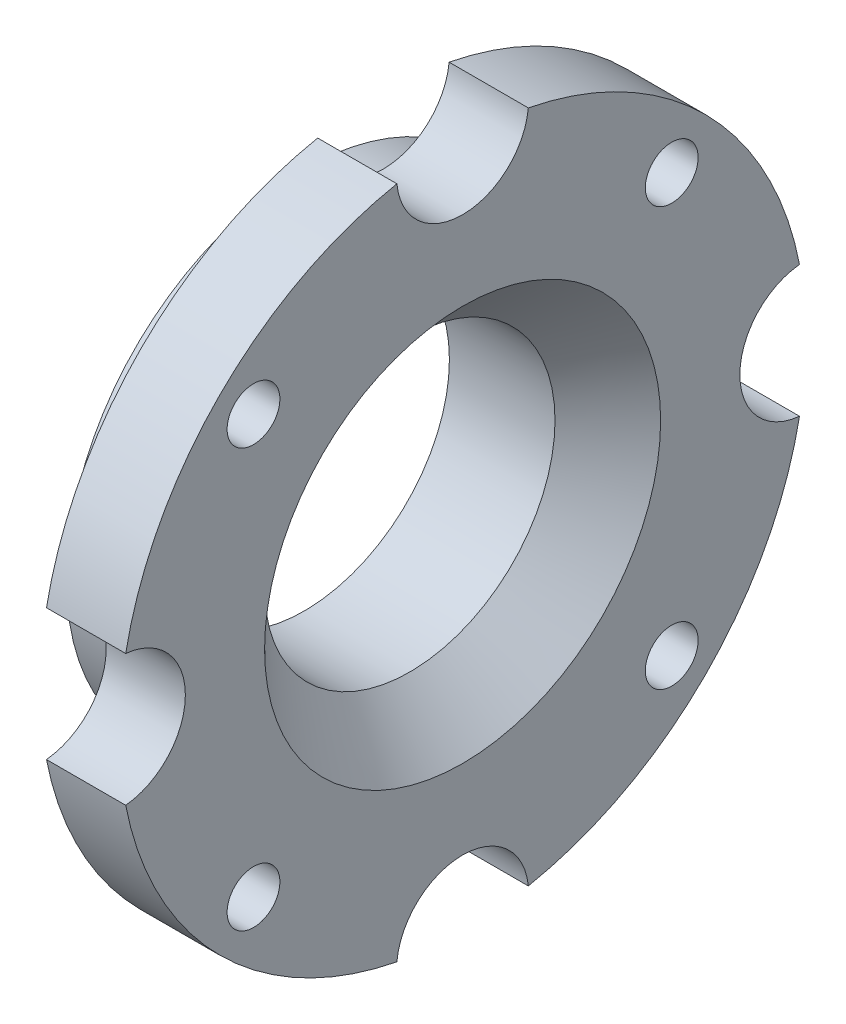
ISO-10303-21;
HEADER;
FILE_DESCRIPTION(('STEP AP214'),'2;1');
FILE_NAME('part.step','',(''),(''),'','','');
FILE_SCHEMA(('AUTOMOTIVE_DESIGN { 1 0 10303 214 1 1 1 1 }'));
ENDSEC;
DATA;
#1=APPLICATION_CONTEXT('core data for automotive mechanical design processes');
#2=APPLICATION_PROTOCOL_DEFINITION('international standard','automotive_design',2000,#1);
#3=PRODUCT_CONTEXT('',#1,'mechanical');
#4=PRODUCT('Part','Part','',(#3));
#5=PRODUCT_RELATED_PRODUCT_CATEGORY('part','',(#4));
#6=PRODUCT_DEFINITION_FORMATION('','',#4);
#7=PRODUCT_DEFINITION_CONTEXT('part definition',#1,'design');
#8=PRODUCT_DEFINITION('design','',#6,#7);
#9=PRODUCT_DEFINITION_SHAPE('','',#8);
#10=(LENGTH_UNIT() NAMED_UNIT(*) SI_UNIT(.MILLI.,.METRE.));
#11=(NAMED_UNIT(*) PLANE_ANGLE_UNIT() SI_UNIT($,.RADIAN.));
#12=(NAMED_UNIT(*) SI_UNIT($,.STERADIAN.) SOLID_ANGLE_UNIT());
#13=UNCERTAINTY_MEASURE_WITH_UNIT(LENGTH_MEASURE(1.E-05),#10,'distance_accuracy_value','');
#14=(GEOMETRIC_REPRESENTATION_CONTEXT(3) GLOBAL_UNCERTAINTY_ASSIGNED_CONTEXT((#13)) GLOBAL_UNIT_ASSIGNED_CONTEXT((#10,
#11,#12)) REPRESENTATION_CONTEXT('',''));
#15=CARTESIAN_POINT('',(0.,0.,0.));
#16=DIRECTION('',(0.,0.,1.));
#17=DIRECTION('',(1.,0.,0.));
#18=AXIS2_PLACEMENT_3D('',#15,#16,#17);
#19=CARTESIAN_POINT('',(6.,0.,0.));
#20=DIRECTION('',(-1.,0.,0.));
#21=DIRECTION('',(0.,0.,1.));
#22=AXIS2_PLACEMENT_3D('',#19,#20,#21);
#23=CYLINDRICAL_SURFACE('',#22,13.);
#24=CARTESIAN_POINT('',(3.,0.,0.));
#25=DIRECTION('',(1.,0.,0.));
#26=DIRECTION('',(0.,0.,-1.));
#27=AXIS2_PLACEMENT_3D('',#24,#25,#26);
#28=CIRCLE('',#27,13.);
#29=CARTESIAN_POINT('',(3.,2.48841621050146,-12.7596153846154));
#30=VERTEX_POINT('',#29);
#31=CARTESIAN_POINT('',(3.,12.7596153846154,-2.48841621050145));
#32=VERTEX_POINT('',#31);
#33=EDGE_CURVE('E139',#30,#32,#28,.T.);
#34=ORIENTED_EDGE('',*,*,#33,.T.);
#35=DIRECTION('',(1.,0.,0.));
#36=VECTOR('',#35,1.);
#37=CARTESIAN_POINT('',(3.,12.7596153846154,-2.48841621050145));
#38=LINE('',#37,#36);
#39=CARTESIAN_POINT('',(6.,12.7596153846154,-2.48841621050145));
#40=VERTEX_POINT('',#39);
#41=EDGE_CURVE('E164',#32,#40,#38,.T.);
#42=ORIENTED_EDGE('',*,*,#41,.T.);
#43=CARTESIAN_POINT('',(6.,0.,0.));
#44=DIRECTION('',(1.,0.,0.));
#45=DIRECTION('',(0.,0.,-1.));
#46=AXIS2_PLACEMENT_3D('',#43,#44,#45);
#47=CIRCLE('',#46,13.);
#48=CARTESIAN_POINT('',(6.,2.48841621050146,-12.7596153846154));
#49=VERTEX_POINT('',#48);
#50=EDGE_CURVE('E130',#49,#40,#47,.T.);
#51=ORIENTED_EDGE('',*,*,#50,.F.);
#52=DIRECTION('',(1.,0.,0.));
#53=VECTOR('',#52,1.);
#54=CARTESIAN_POINT('',(3.,2.48841621050146,-12.7596153846154));
#55=LINE('',#54,#53);
#56=EDGE_CURVE('E156',#49,#30,#55,.F.);
#57=ORIENTED_EDGE('',*,*,#56,.T.);
#58=EDGE_LOOP('',(#34,#42,#51,#57));
#59=FACE_BOUND('',#58,.T.);
#60=ADVANCED_FACE('F40',(#59),#23,.T.);
#61=CARTESIAN_POINT('',(3.,-12.7596153846154,-2.48841621050146));
#62=VERTEX_POINT('',#61);
#63=CARTESIAN_POINT('',(3.,-2.48841621050144,-12.7596153846154));
#64=VERTEX_POINT('',#63);
#65=EDGE_CURVE('E142',#62,#64,#28,.T.);
#66=ORIENTED_EDGE('',*,*,#65,.T.);
#67=DIRECTION('',(1.,0.,0.));
#68=VECTOR('',#67,1.);
#69=CARTESIAN_POINT('',(3.,-2.48841621050144,-12.7596153846154));
#70=LINE('',#69,#68);
#71=CARTESIAN_POINT('',(6.,-2.48841621050144,-12.7596153846154));
#72=VERTEX_POINT('',#71);
#73=EDGE_CURVE('E159',#64,#72,#70,.T.);
#74=ORIENTED_EDGE('',*,*,#73,.T.);
#75=CARTESIAN_POINT('',(6.,-12.7596153846154,-2.48841621050145));
#76=VERTEX_POINT('',#75);
#77=EDGE_CURVE('E134',#76,#72,#47,.T.);
#78=ORIENTED_EDGE('',*,*,#77,.F.);
#79=DIRECTION('',(1.,0.,0.));
#80=VECTOR('',#79,1.);
#81=CARTESIAN_POINT('',(3.,-12.7596153846154,-2.48841621050145));
#82=LINE('',#81,#80);
#83=EDGE_CURVE('E123',#76,#62,#82,.F.);
#84=ORIENTED_EDGE('',*,*,#83,.T.);
#85=EDGE_LOOP('',(#66,#74,#78,#84));
#86=FACE_BOUND('',#85,.T.);
#87=ADVANCED_FACE('F196',(#86),#23,.T.);
#88=CARTESIAN_POINT('',(3.,-2.48841621050146,12.7596153846154));
#89=VERTEX_POINT('',#88);
#90=CARTESIAN_POINT('',(3.,-12.7596153846154,2.48841621050145));
#91=VERTEX_POINT('',#90);
#92=EDGE_CURVE('E227',#89,#91,#28,.T.);
#93=ORIENTED_EDGE('',*,*,#92,.T.);
#94=DIRECTION('',(1.,0.,0.));
#95=VECTOR('',#94,1.);
#96=CARTESIAN_POINT('',(3.,-12.7596153846154,2.48841621050145));
#97=LINE('',#96,#95);
#98=CARTESIAN_POINT('',(6.,-12.7596153846154,2.48841621050145));
#99=VERTEX_POINT('',#98);
#100=EDGE_CURVE('E153',#91,#99,#97,.T.);
#101=ORIENTED_EDGE('',*,*,#100,.T.);
#102=CARTESIAN_POINT('',(6.,-2.48841621050146,12.7596153846154));
#103=VERTEX_POINT('',#102);
#104=EDGE_CURVE('E131',#103,#99,#47,.T.);
#105=ORIENTED_EDGE('',*,*,#104,.F.);
#106=DIRECTION('',(1.,0.,0.));
#107=VECTOR('',#106,1.);
#108=CARTESIAN_POINT('',(3.,-2.48841621050146,12.7596153846154));
#109=LINE('',#108,#107);
#110=EDGE_CURVE('E108',#103,#89,#109,.F.);
#111=ORIENTED_EDGE('',*,*,#110,.T.);
#112=EDGE_LOOP('',(#93,#101,#105,#111));
#113=FACE_BOUND('',#112,.T.);
#114=ADVANCED_FACE('F203',(#113),#23,.T.);
#115=CARTESIAN_POINT('',(0.,0.,0.));
#116=DIRECTION('',(1.,0.,0.));
#117=DIRECTION('',(0.,0.,-1.));
#118=AXIS2_PLACEMENT_3D('',#115,#116,#117);
#119=PLANE('',#118);
#120=CARTESIAN_POINT('',(0.,0.,0.));
#121=DIRECTION('',(1.,0.,0.));
#122=DIRECTION('',(0.,0.,-1.));
#123=AXIS2_PLACEMENT_3D('',#120,#121,#122);
#124=CIRCLE('',#123,9.);
#125=CARTESIAN_POINT('',(0.,0.,-9.));
#126=VERTEX_POINT('',#125);
#127=EDGE_CURVE('E145',#126,#126,#124,.T.);
#128=ORIENTED_EDGE('',*,*,#127,.F.);
#129=EDGE_LOOP('',(#128));
#130=FACE_BOUND('',#129,.T.);
#131=CARTESIAN_POINT('',(0.,0.,0.));
#132=DIRECTION('',(1.,0.,0.));
#133=DIRECTION('',(0.,0.,-1.));
#134=AXIS2_PLACEMENT_3D('',#131,#132,#133);
#135=CIRCLE('',#134,5.5);
#136=CARTESIAN_POINT('',(0.,0.,-5.5));
#137=VERTEX_POINT('',#136);
#138=EDGE_CURVE('E133',#137,#137,#135,.T.);
#139=ORIENTED_EDGE('',*,*,#138,.T.);
#140=EDGE_LOOP('',(#139));
#141=FACE_BOUND('',#140,.T.);
#142=ADVANCED_FACE('F217',(#130,#141),#119,.F.);
#143=CARTESIAN_POINT('',(3.,0.,0.));
#144=DIRECTION('',(-1.,0.,0.));
#145=DIRECTION('',(0.,0.,1.));
#146=AXIS2_PLACEMENT_3D('',#143,#144,#145);
#147=CYLINDRICAL_SURFACE('',#146,9.);
#148=CARTESIAN_POINT('',(3.,0.,0.));
#149=DIRECTION('',(1.,0.,0.));
#150=DIRECTION('',(0.,0.,-1.));
#151=AXIS2_PLACEMENT_3D('',#148,#149,#150);
#152=CIRCLE('',#151,9.);
#153=CARTESIAN_POINT('',(3.,0.,-9.));
#154=VERTEX_POINT('',#153);
#155=EDGE_CURVE('E146',#154,#154,#152,.T.);
#156=ORIENTED_EDGE('',*,*,#155,.F.);
#157=EDGE_LOOP('',(#156));
#158=FACE_BOUND('',#157,.T.);
#159=ORIENTED_EDGE('',*,*,#127,.T.);
#160=EDGE_LOOP('',(#159));
#161=FACE_BOUND('',#160,.T.);
#162=ADVANCED_FACE('F222',(#158,#161),#147,.T.);
#163=CARTESIAN_POINT('',(3.,0.,0.));
#164=DIRECTION('',(-1.,0.,0.));
#165=DIRECTION('',(0.,0.,1.));
#166=AXIS2_PLACEMENT_3D('',#163,#164,#165);
#167=CYLINDRICAL_SURFACE('',#166,5.5);
#168=CARTESIAN_POINT('',(3.99999999999998,0.,0.));
#169=DIRECTION('',(1.,0.,0.));
#170=DIRECTION('',(0.,0.,-1.));
#171=AXIS2_PLACEMENT_3D('',#168,#169,#170);
#172=CIRCLE('',#171,5.5);
#173=CARTESIAN_POINT('',(3.99999999999998,0.,-5.5));
#174=VERTEX_POINT('',#173);
#175=EDGE_CURVE('E49',#174,#174,#172,.T.);
#176=ORIENTED_EDGE('',*,*,#175,.T.);
#177=EDGE_LOOP('',(#176));
#178=FACE_BOUND('',#177,.T.);
#179=ORIENTED_EDGE('',*,*,#138,.F.);
#180=EDGE_LOOP('',(#179));
#181=FACE_BOUND('',#180,.T.);
#182=ADVANCED_FACE('F181',(#178,#181),#167,.F.);
#183=CARTESIAN_POINT('',(6.,0.,0.));
#184=DIRECTION('',(1.,0.,0.));
#185=DIRECTION('',(0.,0.,-1.));
#186=AXIS2_PLACEMENT_3D('',#183,#184,#185);
#187=PLANE('',#186);
#188=CARTESIAN_POINT('',(6.,0.,0.));
#189=DIRECTION('',(1.,0.,0.));
#190=DIRECTION('',(0.,0.,-1.));
#191=AXIS2_PLACEMENT_3D('',#188,#189,#190);
#192=CIRCLE('',#191,7.50000000000002);
#193=CARTESIAN_POINT('',(6.,0.,-7.50000000000002));
#194=VERTEX_POINT('',#193);
#195=EDGE_CURVE('E11',#194,#194,#192,.F.);
#196=ORIENTED_EDGE('',*,*,#195,.T.);
#197=EDGE_LOOP('',(#196));
#198=FACE_BOUND('',#197,.T.);
#199=CARTESIAN_POINT('',(6.,13.,0.));
#200=DIRECTION('',(1.,0.,0.));
#201=DIRECTION('',(0.,0.,-1.));
#202=AXIS2_PLACEMENT_3D('',#199,#200,#201);
#203=CIRCLE('',#202,2.5);
#204=CARTESIAN_POINT('',(6.,12.7596153846154,2.48841621050145));
#205=VERTEX_POINT('',#204);
#206=EDGE_CURVE('E129',#205,#40,#203,.T.);
#207=ORIENTED_EDGE('',*,*,#206,.F.);
#208=CARTESIAN_POINT('',(6.,2.48841621050144,12.7596153846154));
#209=VERTEX_POINT('',#208);
#210=EDGE_CURVE('E120',#205,#209,#47,.T.);
#211=ORIENTED_EDGE('',*,*,#210,.T.);
#212=CARTESIAN_POINT('',(6.,0.,13.));
#213=DIRECTION('',(1.,0.,0.));
#214=DIRECTION('',(0.,0.,-1.));
#215=AXIS2_PLACEMENT_3D('',#212,#213,#214);
#216=CIRCLE('',#215,2.5);
#217=EDGE_CURVE('E104',#103,#209,#216,.T.);
#218=ORIENTED_EDGE('',*,*,#217,.F.);
#219=ORIENTED_EDGE('',*,*,#104,.T.);
#220=CARTESIAN_POINT('',(6.,-13.,0.));
#221=DIRECTION('',(1.,0.,0.));
#222=DIRECTION('',(0.,0.,-1.));
#223=AXIS2_PLACEMENT_3D('',#220,#221,#222);
#224=CIRCLE('',#223,2.5);
#225=EDGE_CURVE('E113',#76,#99,#224,.T.);
#226=ORIENTED_EDGE('',*,*,#225,.F.);
#227=ORIENTED_EDGE('',*,*,#77,.T.);
#228=CARTESIAN_POINT('',(6.,0.,-13.));
#229=DIRECTION('',(1.,0.,0.));
#230=DIRECTION('',(0.,0.,-1.));
#231=AXIS2_PLACEMENT_3D('',#228,#229,#230);
#232=CIRCLE('',#231,2.5);
#233=EDGE_CURVE('E248',#49,#72,#232,.T.);
#234=ORIENTED_EDGE('',*,*,#233,.F.);
#235=ORIENTED_EDGE('',*,*,#50,.T.);
#236=EDGE_LOOP('',(#207,#211,#218,#219,#226,#227,#234,#235));
#237=FACE_BOUND('',#236,.T.);
#238=CARTESIAN_POINT('',(6.,-7.91959594928937,-7.91959594928929));
#239=DIRECTION('',(1.,0.,0.));
#240=DIRECTION('',(0.,0.,-1.));
#241=AXIS2_PLACEMENT_3D('',#238,#239,#240);
#242=CIRCLE('',#241,1.);
#243=CARTESIAN_POINT('',(6.,-7.91959594928937,-8.91959594928929));
#244=VERTEX_POINT('',#243);
#245=EDGE_CURVE('E251',#244,#244,#242,.T.);
#246=ORIENTED_EDGE('',*,*,#245,.F.);
#247=EDGE_LOOP('',(#246));
#248=FACE_BOUND('',#247,.T.);
#249=CARTESIAN_POINT('',(6.,-7.91959594928929,7.91959594928935));
#250=DIRECTION('',(1.,0.,0.));
#251=DIRECTION('',(0.,0.,-1.));
#252=AXIS2_PLACEMENT_3D('',#249,#250,#251);
#253=CIRCLE('',#252,1.00000000000004);
#254=CARTESIAN_POINT('',(6.,-7.91959594928929,6.91959594928931));
#255=VERTEX_POINT('',#254);
#256=EDGE_CURVE('E247',#255,#255,#253,.T.);
#257=ORIENTED_EDGE('',*,*,#256,.F.);
#258=EDGE_LOOP('',(#257));
#259=FACE_BOUND('',#258,.T.);
#260=CARTESIAN_POINT('',(6.,7.91959594928943,7.91959594928924));
#261=DIRECTION('',(1.,0.,0.));
#262=DIRECTION('',(0.,0.,-1.));
#263=AXIS2_PLACEMENT_3D('',#260,#261,#262);
#264=CIRCLE('',#263,1.);
#265=CARTESIAN_POINT('',(6.,7.91959594928943,6.91959594928923));
#266=VERTEX_POINT('',#265);
#267=EDGE_CURVE('E244',#266,#266,#264,.T.);
#268=ORIENTED_EDGE('',*,*,#267,.F.);
#269=EDGE_LOOP('',(#268));
#270=FACE_BOUND('',#269,.T.);
#271=CARTESIAN_POINT('',(6.,7.91959594928932,-7.91959594928934));
#272=DIRECTION('',(1.,0.,0.));
#273=DIRECTION('',(0.,0.,-1.));
#274=AXIS2_PLACEMENT_3D('',#271,#272,#273);
#275=CIRCLE('',#274,1.);
#276=CARTESIAN_POINT('',(6.,7.91959594928932,-8.91959594928934));
#277=VERTEX_POINT('',#276);
#278=EDGE_CURVE('E241',#277,#277,#275,.T.);
#279=ORIENTED_EDGE('',*,*,#278,.F.);
#280=EDGE_LOOP('',(#279));
#281=FACE_BOUND('',#280,.T.);
#282=ADVANCED_FACE('F126',(#198,#237,#248,#259,#270,#281),#187,.T.);
#283=CARTESIAN_POINT('',(3.,0.,0.));
#284=DIRECTION('',(1.,0.,0.));
#285=DIRECTION('',(0.,0.,-1.));
#286=AXIS2_PLACEMENT_3D('',#283,#284,#285);
#287=PLANE('',#286);
#288=CARTESIAN_POINT('',(3.,-7.91959594928937,-7.91959594928929));
#289=DIRECTION('',(1.,0.,0.));
#290=DIRECTION('',(0.,0.,-1.));
#291=AXIS2_PLACEMENT_3D('',#288,#289,#290);
#292=CIRCLE('',#291,1.);
#293=CARTESIAN_POINT('',(3.,-7.91959594928937,-8.91959594928929));
#294=VERTEX_POINT('',#293);
#295=EDGE_CURVE('E176',#294,#294,#292,.T.);
#296=ORIENTED_EDGE('',*,*,#295,.T.);
#297=EDGE_LOOP('',(#296));
#298=FACE_BOUND('',#297,.T.);
#299=CARTESIAN_POINT('',(3.,-7.91959594928929,7.91959594928935));
#300=DIRECTION('',(1.,0.,0.));
#301=DIRECTION('',(0.,0.,-1.));
#302=AXIS2_PLACEMENT_3D('',#299,#300,#301);
#303=CIRCLE('',#302,1.00000000000004);
#304=CARTESIAN_POINT('',(3.,-7.91959594928929,6.91959594928931));
#305=VERTEX_POINT('',#304);
#306=EDGE_CURVE('E173',#305,#305,#303,.T.);
#307=ORIENTED_EDGE('',*,*,#306,.T.);
#308=EDGE_LOOP('',(#307));
#309=FACE_BOUND('',#308,.T.);
#310=CARTESIAN_POINT('',(3.,7.91959594928943,7.91959594928924));
#311=DIRECTION('',(1.,0.,0.));
#312=DIRECTION('',(0.,0.,-1.));
#313=AXIS2_PLACEMENT_3D('',#310,#311,#312);
#314=CIRCLE('',#313,1.);
#315=CARTESIAN_POINT('',(3.,7.91959594928943,6.91959594928923));
#316=VERTEX_POINT('',#315);
#317=EDGE_CURVE('E170',#316,#316,#314,.T.);
#318=ORIENTED_EDGE('',*,*,#317,.T.);
#319=EDGE_LOOP('',(#318));
#320=FACE_BOUND('',#319,.T.);
#321=CARTESIAN_POINT('',(3.,7.91959594928932,-7.91959594928934));
#322=DIRECTION('',(1.,0.,0.));
#323=DIRECTION('',(0.,0.,-1.));
#324=AXIS2_PLACEMENT_3D('',#321,#322,#323);
#325=CIRCLE('',#324,1.);
#326=CARTESIAN_POINT('',(3.,7.91959594928932,-8.91959594928934));
#327=VERTEX_POINT('',#326);
#328=EDGE_CURVE('E167',#327,#327,#325,.T.);
#329=ORIENTED_EDGE('',*,*,#328,.T.);
#330=EDGE_LOOP('',(#329));
#331=FACE_BOUND('',#330,.T.);
#332=ORIENTED_EDGE('',*,*,#155,.T.);
#333=EDGE_LOOP('',(#332));
#334=FACE_BOUND('',#333,.T.);
#335=CARTESIAN_POINT('',(3.,12.7596153846154,2.48841621050145));
#336=VERTEX_POINT('',#335);
#337=CARTESIAN_POINT('',(3.,2.48841621050144,12.7596153846154));
#338=VERTEX_POINT('',#337);
#339=EDGE_CURVE('E122',#336,#338,#28,.T.);
#340=ORIENTED_EDGE('',*,*,#339,.F.);
#341=CARTESIAN_POINT('',(3.,13.,0.));
#342=DIRECTION('',(1.,0.,0.));
#343=DIRECTION('',(0.,0.,-1.));
#344=AXIS2_PLACEMENT_3D('',#341,#342,#343);
#345=CIRCLE('',#344,2.5);
#346=EDGE_CURVE('E137',#336,#32,#345,.T.);
#347=ORIENTED_EDGE('',*,*,#346,.T.);
#348=ORIENTED_EDGE('',*,*,#33,.F.);
#349=CARTESIAN_POINT('',(3.,0.,-13.));
#350=DIRECTION('',(1.,0.,0.));
#351=DIRECTION('',(0.,0.,-1.));
#352=AXIS2_PLACEMENT_3D('',#349,#350,#351);
#353=CIRCLE('',#352,2.5);
#354=EDGE_CURVE('E235',#30,#64,#353,.T.);
#355=ORIENTED_EDGE('',*,*,#354,.T.);
#356=ORIENTED_EDGE('',*,*,#65,.F.);
#357=CARTESIAN_POINT('',(3.,-13.,0.));
#358=DIRECTION('',(1.,0.,0.));
#359=DIRECTION('',(0.,0.,-1.));
#360=AXIS2_PLACEMENT_3D('',#357,#358,#359);
#361=CIRCLE('',#360,2.5);
#362=EDGE_CURVE('E56',#62,#91,#361,.T.);
#363=ORIENTED_EDGE('',*,*,#362,.T.);
#364=ORIENTED_EDGE('',*,*,#92,.F.);
#365=CARTESIAN_POINT('',(3.,0.,13.));
#366=DIRECTION('',(1.,0.,0.));
#367=DIRECTION('',(0.,0.,-1.));
#368=AXIS2_PLACEMENT_3D('',#365,#366,#367);
#369=CIRCLE('',#368,2.5);
#370=EDGE_CURVE('E64',#89,#338,#369,.T.);
#371=ORIENTED_EDGE('',*,*,#370,.T.);
#372=EDGE_LOOP('',(#340,#347,#348,#355,#356,#363,#364,#371));
#373=FACE_BOUND('',#372,.T.);
#374=ADVANCED_FACE('F208',(#298,#309,#320,#331,#334,#373),#287,.F.);
#375=ORIENTED_EDGE('',*,*,#210,.F.);
#376=DIRECTION('',(1.,0.,0.));
#377=VECTOR('',#376,1.);
#378=CARTESIAN_POINT('',(3.,12.7596153846154,2.48841621050145));
#379=LINE('',#378,#377);
#380=EDGE_CURVE('E162',#205,#336,#379,.F.);
#381=ORIENTED_EDGE('',*,*,#380,.T.);
#382=ORIENTED_EDGE('',*,*,#339,.T.);
#383=DIRECTION('',(1.,0.,0.));
#384=VECTOR('',#383,1.);
#385=CARTESIAN_POINT('',(3.,2.48841621050144,12.7596153846154));
#386=LINE('',#385,#384);
#387=EDGE_CURVE('E107',#338,#209,#386,.T.);
#388=ORIENTED_EDGE('',*,*,#387,.T.);
#389=EDGE_LOOP('',(#375,#381,#382,#388));
#390=FACE_BOUND('',#389,.T.);
#391=ADVANCED_FACE('F118',(#390),#23,.T.);
#392=CARTESIAN_POINT('',(0.,0.,13.));
#393=DIRECTION('',(1.,0.,0.));
#394=DIRECTION('',(0.,0.,-1.));
#395=AXIS2_PLACEMENT_3D('',#392,#393,#394);
#396=CYLINDRICAL_SURFACE('',#395,2.5);
#397=ORIENTED_EDGE('',*,*,#370,.F.);
#398=ORIENTED_EDGE('',*,*,#110,.F.);
#399=ORIENTED_EDGE('',*,*,#217,.T.);
#400=ORIENTED_EDGE('',*,*,#387,.F.);
#401=EDGE_LOOP('',(#397,#398,#399,#400));
#402=FACE_BOUND('',#401,.T.);
#403=ADVANCED_FACE('F106',(#402),#396,.F.);
#404=CARTESIAN_POINT('',(0.,-13.,0.));
#405=DIRECTION('',(1.,0.,0.));
#406=DIRECTION('',(0.,0.,-1.));
#407=AXIS2_PLACEMENT_3D('',#404,#405,#406);
#408=CYLINDRICAL_SURFACE('',#407,2.5);
#409=ORIENTED_EDGE('',*,*,#362,.F.);
#410=ORIENTED_EDGE('',*,*,#83,.F.);
#411=ORIENTED_EDGE('',*,*,#225,.T.);
#412=ORIENTED_EDGE('',*,*,#100,.F.);
#413=EDGE_LOOP('',(#409,#410,#411,#412));
#414=FACE_BOUND('',#413,.T.);
#415=ADVANCED_FACE('F213',(#414),#408,.F.);
#416=CARTESIAN_POINT('',(0.,0.,-13.));
#417=DIRECTION('',(1.,0.,0.));
#418=DIRECTION('',(0.,0.,-1.));
#419=AXIS2_PLACEMENT_3D('',#416,#417,#418);
#420=CYLINDRICAL_SURFACE('',#419,2.5);
#421=ORIENTED_EDGE('',*,*,#354,.F.);
#422=ORIENTED_EDGE('',*,*,#56,.F.);
#423=ORIENTED_EDGE('',*,*,#233,.T.);
#424=ORIENTED_EDGE('',*,*,#73,.F.);
#425=EDGE_LOOP('',(#421,#422,#423,#424));
#426=FACE_BOUND('',#425,.T.);
#427=ADVANCED_FACE('F257',(#426),#420,.F.);
#428=CARTESIAN_POINT('',(0.,13.,0.));
#429=DIRECTION('',(1.,0.,0.));
#430=DIRECTION('',(0.,0.,-1.));
#431=AXIS2_PLACEMENT_3D('',#428,#429,#430);
#432=CYLINDRICAL_SURFACE('',#431,2.5);
#433=ORIENTED_EDGE('',*,*,#346,.F.);
#434=ORIENTED_EDGE('',*,*,#380,.F.);
#435=ORIENTED_EDGE('',*,*,#206,.T.);
#436=ORIENTED_EDGE('',*,*,#41,.F.);
#437=EDGE_LOOP('',(#433,#434,#435,#436));
#438=FACE_BOUND('',#437,.T.);
#439=ADVANCED_FACE('F261',(#438),#432,.F.);
#440=CARTESIAN_POINT('',(0.,7.91959594928932,-7.91959594928934));
#441=DIRECTION('',(1.,0.,0.));
#442=DIRECTION('',(0.,0.,-1.));
#443=AXIS2_PLACEMENT_3D('',#440,#441,#442);
#444=CYLINDRICAL_SURFACE('',#443,1.);
#445=ORIENTED_EDGE('',*,*,#278,.T.);
#446=EDGE_LOOP('',(#445));
#447=FACE_BOUND('',#446,.T.);
#448=ORIENTED_EDGE('',*,*,#328,.F.);
#449=EDGE_LOOP('',(#448));
#450=FACE_BOUND('',#449,.T.);
#451=ADVANCED_FACE('F263',(#447,#450),#444,.F.);
#452=CARTESIAN_POINT('',(0.,7.91959594928943,7.91959594928924));
#453=DIRECTION('',(1.,0.,0.));
#454=DIRECTION('',(0.,0.,-1.));
#455=AXIS2_PLACEMENT_3D('',#452,#453,#454);
#456=CYLINDRICAL_SURFACE('',#455,1.);
#457=ORIENTED_EDGE('',*,*,#267,.T.);
#458=EDGE_LOOP('',(#457));
#459=FACE_BOUND('',#458,.T.);
#460=ORIENTED_EDGE('',*,*,#317,.F.);
#461=EDGE_LOOP('',(#460));
#462=FACE_BOUND('',#461,.T.);
#463=ADVANCED_FACE('F269',(#459,#462),#456,.F.);
#464=CARTESIAN_POINT('',(0.,-7.91959594928929,7.91959594928935));
#465=DIRECTION('',(1.,0.,0.));
#466=DIRECTION('',(0.,0.,-1.));
#467=AXIS2_PLACEMENT_3D('',#464,#465,#466);
#468=CYLINDRICAL_SURFACE('',#467,1.00000000000004);
#469=ORIENTED_EDGE('',*,*,#256,.T.);
#470=EDGE_LOOP('',(#469));
#471=FACE_BOUND('',#470,.T.);
#472=ORIENTED_EDGE('',*,*,#306,.F.);
#473=EDGE_LOOP('',(#472));
#474=FACE_BOUND('',#473,.T.);
#475=ADVANCED_FACE('F191',(#471,#474),#468,.F.);
#476=CARTESIAN_POINT('',(0.,-7.91959594928937,-7.91959594928929));
#477=DIRECTION('',(1.,0.,0.));
#478=DIRECTION('',(0.,0.,-1.));
#479=AXIS2_PLACEMENT_3D('',#476,#477,#478);
#480=CYLINDRICAL_SURFACE('',#479,1.);
#481=ORIENTED_EDGE('',*,*,#245,.T.);
#482=EDGE_LOOP('',(#481));
#483=FACE_BOUND('',#482,.T.);
#484=ORIENTED_EDGE('',*,*,#295,.F.);
#485=EDGE_LOOP('',(#484));
#486=FACE_BOUND('',#485,.T.);
#487=ADVANCED_FACE('F185',(#483,#486),#480,.F.);
#488=CARTESIAN_POINT('',(3.99999999999998,0.,0.));
#489=DIRECTION('',(1.,0.,0.));
#490=DIRECTION('',(0.,0.,-1.));
#491=AXIS2_PLACEMENT_3D('',#488,#489,#490);
#492=CONICAL_SURFACE('',#491,5.5,0.785398163397448);
#493=ORIENTED_EDGE('',*,*,#195,.F.);
#494=EDGE_LOOP('',(#493));
#495=FACE_BOUND('',#494,.T.);
#496=ORIENTED_EDGE('',*,*,#175,.F.);
#497=EDGE_LOOP('',(#496));
#498=FACE_BOUND('',#497,.T.);
#499=ADVANCED_FACE('F43',(#495,#498),#492,.F.);
#500=CLOSED_SHELL('',(#60,#87,#114,#142,#162,#182,#282,#374,#391,#403,#415,#427,#439,#451,#463,
#475,#487,#499));
#501=MANIFOLD_SOLID_BREP('B2',#500);
#502=ADVANCED_BREP_SHAPE_REPRESENTATION('',(#18,#501),#14);
#503=SHAPE_DEFINITION_REPRESENTATION(#9,#502);
ENDSEC;
END-ISO-10303-21;
